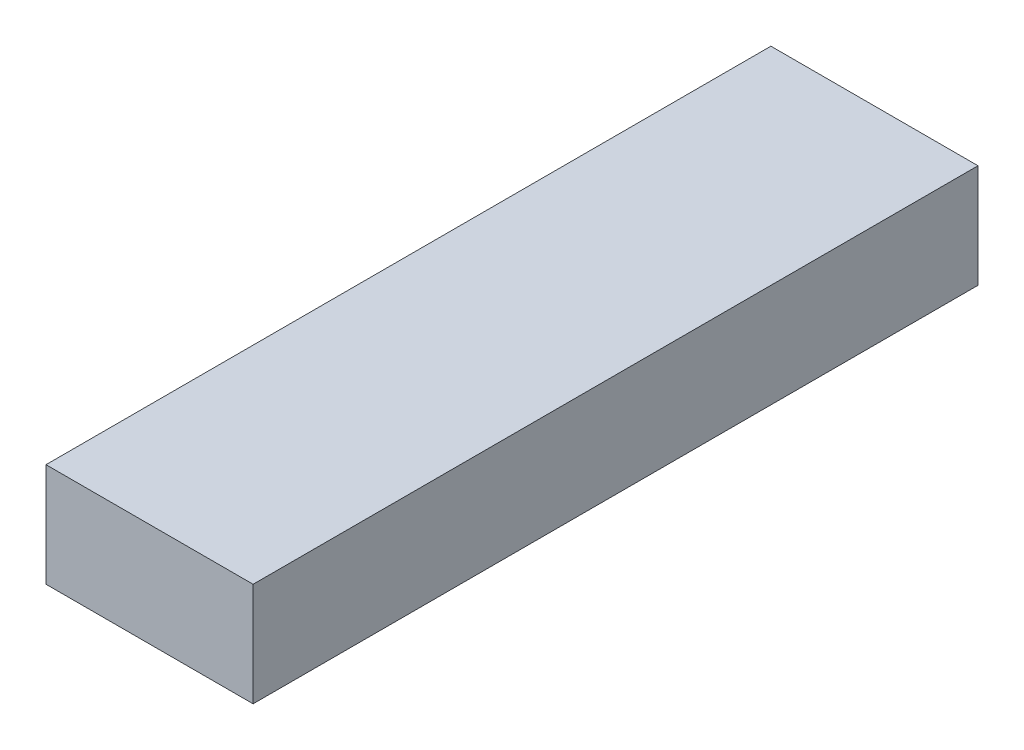
ISO-10303-21;
HEADER;
FILE_DESCRIPTION(('STEP AP214'),'2;1');
FILE_NAME('part.step','',(''),(''),'','','');
FILE_SCHEMA(('AUTOMOTIVE_DESIGN { 1 0 10303 214 1 1 1 1 }'));
ENDSEC;
DATA;
#1=APPLICATION_CONTEXT('core data for automotive mechanical design processes');
#2=APPLICATION_PROTOCOL_DEFINITION('international standard','automotive_design',2000,#1);
#3=PRODUCT_CONTEXT('',#1,'mechanical');
#4=PRODUCT('Part','Part','',(#3));
#5=PRODUCT_RELATED_PRODUCT_CATEGORY('part','',(#4));
#6=PRODUCT_DEFINITION_FORMATION('','',#4);
#7=PRODUCT_DEFINITION_CONTEXT('part definition',#1,'design');
#8=PRODUCT_DEFINITION('design','',#6,#7);
#9=PRODUCT_DEFINITION_SHAPE('','',#8);
#10=(LENGTH_UNIT() NAMED_UNIT(*) SI_UNIT(.MILLI.,.METRE.));
#11=(NAMED_UNIT(*) PLANE_ANGLE_UNIT() SI_UNIT($,.RADIAN.));
#12=(NAMED_UNIT(*) SI_UNIT($,.STERADIAN.) SOLID_ANGLE_UNIT());
#13=UNCERTAINTY_MEASURE_WITH_UNIT(LENGTH_MEASURE(1.E-05),#10,'distance_accuracy_value','');
#14=(GEOMETRIC_REPRESENTATION_CONTEXT(3) GLOBAL_UNCERTAINTY_ASSIGNED_CONTEXT((#13)) GLOBAL_UNIT_ASSIGNED_CONTEXT((#10,
#11,#12)) REPRESENTATION_CONTEXT('',''));
#15=CARTESIAN_POINT('',(0.,0.,0.));
#16=DIRECTION('',(0.,0.,1.));
#17=DIRECTION('',(1.,0.,0.));
#18=AXIS2_PLACEMENT_3D('',#15,#16,#17);
#19=CARTESIAN_POINT('',(10.,10.,35.));
#20=DIRECTION('',(-1.,0.,0.));
#21=DIRECTION('',(0.,0.,1.));
#22=AXIS2_PLACEMENT_3D('',#19,#20,#21);
#23=PLANE('',#22);
#24=DIRECTION('',(0.,0.,-1.));
#25=VECTOR('',#24,1.);
#26=CARTESIAN_POINT('',(10.,0.,35.));
#27=LINE('',#26,#25);
#28=CARTESIAN_POINT('',(10.,0.,35.));
#29=VERTEX_POINT('',#28);
#30=CARTESIAN_POINT('',(10.,0.,-35.));
#31=VERTEX_POINT('',#30);
#32=EDGE_CURVE('E107',#29,#31,#27,.T.);
#33=ORIENTED_EDGE('',*,*,#32,.T.);
#34=DIRECTION('',(0.,-1.,0.));
#35=VECTOR('',#34,1.);
#36=CARTESIAN_POINT('',(10.,10.,-35.));
#37=LINE('',#36,#35);
#38=CARTESIAN_POINT('',(10.,10.,-35.));
#39=VERTEX_POINT('',#38);
#40=EDGE_CURVE('E11',#39,#31,#37,.T.);
#41=ORIENTED_EDGE('',*,*,#40,.F.);
#42=DIRECTION('',(0.,0.,-1.));
#43=VECTOR('',#42,1.);
#44=CARTESIAN_POINT('',(10.,10.,35.));
#45=LINE('',#44,#43);
#46=CARTESIAN_POINT('',(10.,10.,35.));
#47=VERTEX_POINT('',#46);
#48=EDGE_CURVE('E91',#47,#39,#45,.T.);
#49=ORIENTED_EDGE('',*,*,#48,.F.);
#50=DIRECTION('',(0.,-1.,0.));
#51=VECTOR('',#50,1.);
#52=CARTESIAN_POINT('',(10.,10.,35.));
#53=LINE('',#52,#51);
#54=EDGE_CURVE('E103',#47,#29,#53,.T.);
#55=ORIENTED_EDGE('',*,*,#54,.T.);
#56=EDGE_LOOP('',(#33,#41,#49,#55));
#57=FACE_BOUND('',#56,.T.);
#58=ADVANCED_FACE('F39',(#57),#23,.F.);
#59=CARTESIAN_POINT('',(-10.,10.,-35.));
#60=DIRECTION('',(0.,0.,1.));
#61=DIRECTION('',(1.,0.,0.));
#62=AXIS2_PLACEMENT_3D('',#59,#60,#61);
#63=PLANE('',#62);
#64=DIRECTION('',(-1.,0.,0.));
#65=VECTOR('',#64,1.);
#66=CARTESIAN_POINT('',(-10.,0.,-35.));
#67=LINE('',#66,#65);
#68=CARTESIAN_POINT('',(-10.,0.,-35.));
#69=VERTEX_POINT('',#68);
#70=EDGE_CURVE('E96',#31,#69,#67,.T.);
#71=ORIENTED_EDGE('',*,*,#70,.T.);
#72=DIRECTION('',(0.,-1.,0.));
#73=VECTOR('',#72,1.);
#74=CARTESIAN_POINT('',(-10.,10.,-35.));
#75=LINE('',#74,#73);
#76=CARTESIAN_POINT('',(-10.,10.,-35.));
#77=VERTEX_POINT('',#76);
#78=EDGE_CURVE('E48',#77,#69,#75,.T.);
#79=ORIENTED_EDGE('',*,*,#78,.F.);
#80=DIRECTION('',(-1.,0.,0.));
#81=VECTOR('',#80,1.);
#82=CARTESIAN_POINT('',(-10.,10.,-35.));
#83=LINE('',#82,#81);
#84=EDGE_CURVE('E86',#39,#77,#83,.T.);
#85=ORIENTED_EDGE('',*,*,#84,.F.);
#86=ORIENTED_EDGE('',*,*,#40,.T.);
#87=EDGE_LOOP('',(#71,#79,#85,#86));
#88=FACE_BOUND('',#87,.T.);
#89=ADVANCED_FACE('F95',(#88),#63,.F.);
#90=CARTESIAN_POINT('',(-10.,10.,35.));
#91=DIRECTION('',(1.,0.,0.));
#92=DIRECTION('',(0.,0.,-1.));
#93=AXIS2_PLACEMENT_3D('',#90,#91,#92);
#94=PLANE('',#93);
#95=DIRECTION('',(0.,0.,1.));
#96=VECTOR('',#95,1.);
#97=CARTESIAN_POINT('',(-10.,0.,35.));
#98=LINE('',#97,#96);
#99=CARTESIAN_POINT('',(-10.,0.,35.));
#100=VERTEX_POINT('',#99);
#101=EDGE_CURVE('E73',#69,#100,#98,.T.);
#102=ORIENTED_EDGE('',*,*,#101,.T.);
#103=DIRECTION('',(0.,-1.,0.));
#104=VECTOR('',#103,1.);
#105=CARTESIAN_POINT('',(-10.,10.,35.));
#106=LINE('',#105,#104);
#107=CARTESIAN_POINT('',(-10.,10.,35.));
#108=VERTEX_POINT('',#107);
#109=EDGE_CURVE('E98',#108,#100,#106,.T.);
#110=ORIENTED_EDGE('',*,*,#109,.F.);
#111=DIRECTION('',(0.,0.,1.));
#112=VECTOR('',#111,1.);
#113=CARTESIAN_POINT('',(-10.,10.,35.));
#114=LINE('',#113,#112);
#115=EDGE_CURVE('E89',#77,#108,#114,.T.);
#116=ORIENTED_EDGE('',*,*,#115,.F.);
#117=ORIENTED_EDGE('',*,*,#78,.T.);
#118=EDGE_LOOP('',(#102,#110,#116,#117));
#119=FACE_BOUND('',#118,.T.);
#120=ADVANCED_FACE('F99',(#119),#94,.F.);
#121=CARTESIAN_POINT('',(-10.,10.,35.));
#122=DIRECTION('',(0.,0.,-1.));
#123=DIRECTION('',(-1.,0.,0.));
#124=AXIS2_PLACEMENT_3D('',#121,#122,#123);
#125=PLANE('',#124);
#126=DIRECTION('',(1.,0.,0.));
#127=VECTOR('',#126,1.);
#128=CARTESIAN_POINT('',(-10.,0.,35.));
#129=LINE('',#128,#127);
#130=EDGE_CURVE('E79',#100,#29,#129,.T.);
#131=ORIENTED_EDGE('',*,*,#130,.T.);
#132=ORIENTED_EDGE('',*,*,#54,.F.);
#133=DIRECTION('',(1.,0.,0.));
#134=VECTOR('',#133,1.);
#135=CARTESIAN_POINT('',(-10.,10.,35.));
#136=LINE('',#135,#134);
#137=EDGE_CURVE('E56',#108,#47,#136,.T.);
#138=ORIENTED_EDGE('',*,*,#137,.F.);
#139=ORIENTED_EDGE('',*,*,#109,.T.);
#140=EDGE_LOOP('',(#131,#132,#138,#139));
#141=FACE_BOUND('',#140,.T.);
#142=ADVANCED_FACE('F120',(#141),#125,.F.);
#143=CARTESIAN_POINT('',(0.,10.,0.));
#144=DIRECTION('',(0.,-1.,0.));
#145=DIRECTION('',(0.,0.,-1.));
#146=AXIS2_PLACEMENT_3D('',#143,#144,#145);
#147=PLANE('',#146);
#148=ORIENTED_EDGE('',*,*,#48,.T.);
#149=ORIENTED_EDGE('',*,*,#84,.T.);
#150=ORIENTED_EDGE('',*,*,#115,.T.);
#151=ORIENTED_EDGE('',*,*,#137,.T.);
#152=EDGE_LOOP('',(#148,#149,#150,#151));
#153=FACE_BOUND('',#152,.T.);
#154=ADVANCED_FACE('F87',(#153),#147,.F.);
#155=CARTESIAN_POINT('',(0.,0.,0.));
#156=DIRECTION('',(0.,-1.,0.));
#157=DIRECTION('',(0.,0.,-1.));
#158=AXIS2_PLACEMENT_3D('',#155,#156,#157);
#159=PLANE('',#158);
#160=ORIENTED_EDGE('',*,*,#32,.F.);
#161=ORIENTED_EDGE('',*,*,#130,.F.);
#162=ORIENTED_EDGE('',*,*,#101,.F.);
#163=ORIENTED_EDGE('',*,*,#70,.F.);
#164=EDGE_LOOP('',(#160,#161,#162,#163));
#165=FACE_BOUND('',#164,.T.);
#166=ADVANCED_FACE('F123',(#165),#159,.T.);
#167=CLOSED_SHELL('',(#58,#89,#120,#142,#154,#166));
#168=MANIFOLD_SOLID_BREP('B2',#167);
#169=ADVANCED_BREP_SHAPE_REPRESENTATION('',(#18,#168),#14);
#170=SHAPE_DEFINITION_REPRESENTATION(#9,#169);
ENDSEC;
END-ISO-10303-21;
